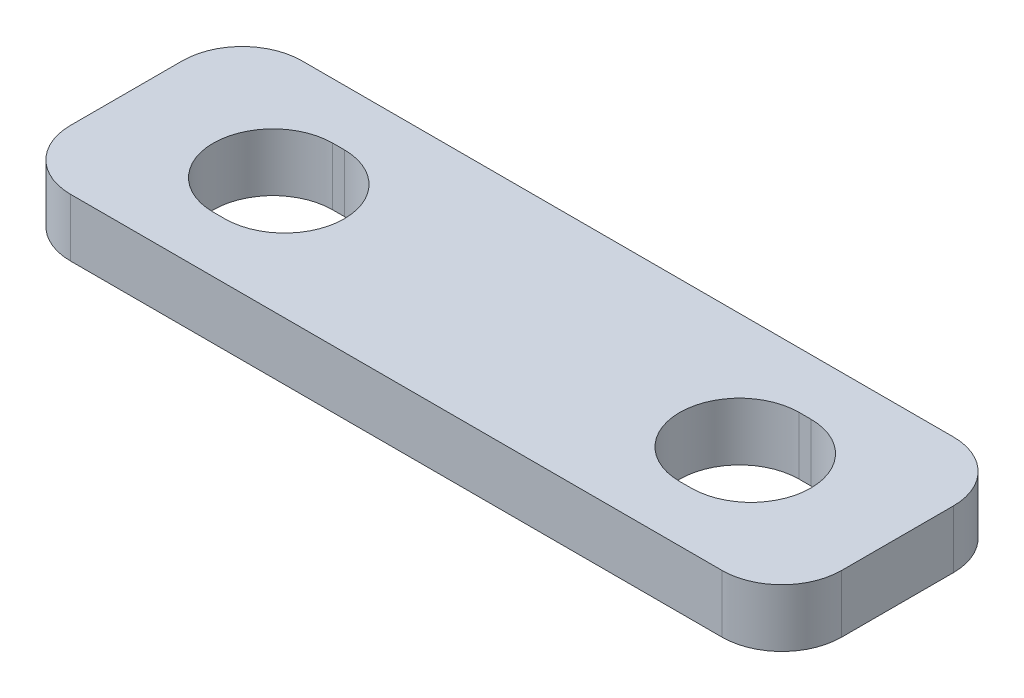
ISO-10303-21;
HEADER;
FILE_DESCRIPTION(('STEP AP214'),'2;1');
FILE_NAME('part.step','',(''),(''),'','','');
FILE_SCHEMA(('AUTOMOTIVE_DESIGN { 1 0 10303 214 1 1 1 1 }'));
ENDSEC;
DATA;
#1=APPLICATION_CONTEXT('core data for automotive mechanical design processes');
#2=APPLICATION_PROTOCOL_DEFINITION('international standard','automotive_design',2000,#1);
#3=PRODUCT_CONTEXT('',#1,'mechanical');
#4=PRODUCT('Part','Part','',(#3));
#5=PRODUCT_RELATED_PRODUCT_CATEGORY('part','',(#4));
#6=PRODUCT_DEFINITION_FORMATION('','',#4);
#7=PRODUCT_DEFINITION_CONTEXT('part definition',#1,'design');
#8=PRODUCT_DEFINITION('design','',#6,#7);
#9=PRODUCT_DEFINITION_SHAPE('','',#8);
#10=(LENGTH_UNIT() NAMED_UNIT(*) SI_UNIT(.MILLI.,.METRE.));
#11=(NAMED_UNIT(*) PLANE_ANGLE_UNIT() SI_UNIT($,.RADIAN.));
#12=(NAMED_UNIT(*) SI_UNIT($,.STERADIAN.) SOLID_ANGLE_UNIT());
#13=UNCERTAINTY_MEASURE_WITH_UNIT(LENGTH_MEASURE(1.E-05),#10,'distance_accuracy_value','');
#14=(GEOMETRIC_REPRESENTATION_CONTEXT(3) GLOBAL_UNCERTAINTY_ASSIGNED_CONTEXT((#13)) GLOBAL_UNIT_ASSIGNED_CONTEXT((#10,
#11,#12)) REPRESENTATION_CONTEXT('',''));
#15=CARTESIAN_POINT('',(0.,0.,0.));
#16=DIRECTION('',(0.,0.,1.));
#17=DIRECTION('',(1.,0.,0.));
#18=AXIS2_PLACEMENT_3D('',#15,#16,#17);
#19=CARTESIAN_POINT('',(0.,1.5,0.));
#20=DIRECTION('',(0.,1.,0.));
#21=DIRECTION('',(0.,0.,1.));
#22=AXIS2_PLACEMENT_3D('',#19,#20,#21);
#23=PLANE('',#22);
#24=DIRECTION('',(0.,0.,1.));
#25=VECTOR('',#24,1.);
#26=CARTESIAN_POINT('',(0.,1.5,-6.));
#27=LINE('',#26,#25);
#28=CARTESIAN_POINT('',(0.,1.5,-4.45));
#29=VERTEX_POINT('',#28);
#30=CARTESIAN_POINT('',(0.,1.5,-1.55));
#31=VERTEX_POINT('',#30);
#32=EDGE_CURVE('E252',#29,#31,#27,.T.);
#33=ORIENTED_EDGE('',*,*,#32,.T.);
#34=CARTESIAN_POINT('',(1.55,1.5,-1.55));
#35=DIRECTION('',(0.,1.,0.));
#36=DIRECTION('',(0.,0.,1.));
#37=AXIS2_PLACEMENT_3D('',#34,#35,#36);
#38=CIRCLE('',#37,1.55);
#39=CARTESIAN_POINT('',(1.55,1.5,0.));
#40=VERTEX_POINT('',#39);
#41=EDGE_CURVE('E314',#31,#40,#38,.T.);
#42=ORIENTED_EDGE('',*,*,#41,.T.);
#43=DIRECTION('',(1.,0.,0.));
#44=VECTOR('',#43,1.);
#45=CARTESIAN_POINT('',(0.,1.5,0.));
#46=LINE('',#45,#44);
#47=CARTESIAN_POINT('',(18.45,1.5,0.));
#48=VERTEX_POINT('',#47);
#49=EDGE_CURVE('E256',#40,#48,#46,.T.);
#50=ORIENTED_EDGE('',*,*,#49,.T.);
#51=CARTESIAN_POINT('',(18.45,1.5,-1.55));
#52=DIRECTION('',(0.,1.,0.));
#53=DIRECTION('',(0.,0.,1.));
#54=AXIS2_PLACEMENT_3D('',#51,#52,#53);
#55=CIRCLE('',#54,1.55);
#56=CARTESIAN_POINT('',(20.,1.5,-1.55));
#57=VERTEX_POINT('',#56);
#58=EDGE_CURVE('E308',#48,#57,#55,.T.);
#59=ORIENTED_EDGE('',*,*,#58,.T.);
#60=DIRECTION('',(0.,0.,-1.));
#61=VECTOR('',#60,1.);
#62=CARTESIAN_POINT('',(20.,1.5,-6.));
#63=LINE('',#62,#61);
#64=CARTESIAN_POINT('',(20.,1.5,-4.45));
#65=VERTEX_POINT('',#64);
#66=EDGE_CURVE('E261',#57,#65,#63,.T.);
#67=ORIENTED_EDGE('',*,*,#66,.T.);
#68=CARTESIAN_POINT('',(18.45,1.5,-4.45));
#69=DIRECTION('',(0.,1.,0.));
#70=DIRECTION('',(0.,0.,1.));
#71=AXIS2_PLACEMENT_3D('',#68,#69,#70);
#72=CIRCLE('',#71,1.55);
#73=CARTESIAN_POINT('',(18.45,1.5,-6.));
#74=VERTEX_POINT('',#73);
#75=EDGE_CURVE('E62',#65,#74,#72,.T.);
#76=ORIENTED_EDGE('',*,*,#75,.T.);
#77=DIRECTION('',(-1.,0.,0.));
#78=VECTOR('',#77,1.);
#79=CARTESIAN_POINT('',(20.,1.5,-6.));
#80=LINE('',#79,#78);
#81=CARTESIAN_POINT('',(1.55,1.5,-6.));
#82=VERTEX_POINT('',#81);
#83=EDGE_CURVE('E264',#74,#82,#80,.T.);
#84=ORIENTED_EDGE('',*,*,#83,.T.);
#85=CARTESIAN_POINT('',(1.55,1.5,-4.45));
#86=DIRECTION('',(0.,1.,0.));
#87=DIRECTION('',(0.,0.,1.));
#88=AXIS2_PLACEMENT_3D('',#85,#86,#87);
#89=CIRCLE('',#88,1.55);
#90=EDGE_CURVE('E311',#82,#29,#89,.T.);
#91=ORIENTED_EDGE('',*,*,#90,.T.);
#92=EDGE_LOOP('',(#33,#42,#50,#59,#67,#76,#84,#91));
#93=FACE_BOUND('',#92,.T.);
#94=DIRECTION('',(-1.,0.,0.));
#95=VECTOR('',#94,1.);
#96=CARTESIAN_POINT('',(16.2,1.5,-4.55));
#97=LINE('',#96,#95);
#98=CARTESIAN_POINT('',(16.2,1.5,-4.55));
#99=VERTEX_POINT('',#98);
#100=CARTESIAN_POINT('',(15.9,1.5,-4.55));
#101=VERTEX_POINT('',#100);
#102=EDGE_CURVE('E212',#99,#101,#97,.T.);
#103=ORIENTED_EDGE('',*,*,#102,.F.);
#104=CARTESIAN_POINT('',(16.2,1.5,-3.));
#105=DIRECTION('',(0.,1.,0.));
#106=DIRECTION('',(0.,0.,1.));
#107=AXIS2_PLACEMENT_3D('',#104,#105,#106);
#108=CIRCLE('',#107,1.55);
#109=CARTESIAN_POINT('',(16.2,1.5,-1.45));
#110=VERTEX_POINT('',#109);
#111=EDGE_CURVE('E209',#110,#99,#108,.T.);
#112=ORIENTED_EDGE('',*,*,#111,.F.);
#113=DIRECTION('',(1.,0.,0.));
#114=VECTOR('',#113,1.);
#115=CARTESIAN_POINT('',(16.2,1.5,-1.45));
#116=LINE('',#115,#114);
#117=CARTESIAN_POINT('',(15.9,1.5,-1.45));
#118=VERTEX_POINT('',#117);
#119=EDGE_CURVE('E220',#118,#110,#116,.T.);
#120=ORIENTED_EDGE('',*,*,#119,.F.);
#121=CARTESIAN_POINT('',(15.9,1.5,-3.));
#122=DIRECTION('',(0.,1.,0.));
#123=DIRECTION('',(0.,0.,1.));
#124=AXIS2_PLACEMENT_3D('',#121,#122,#123);
#125=CIRCLE('',#124,1.55);
#126=EDGE_CURVE('E216',#101,#118,#125,.T.);
#127=ORIENTED_EDGE('',*,*,#126,.F.);
#128=EDGE_LOOP('',(#103,#112,#120,#127));
#129=FACE_BOUND('',#128,.T.);
#130=DIRECTION('',(1.,0.,0.));
#131=VECTOR('',#130,1.);
#132=CARTESIAN_POINT('',(3.8,1.5,-1.45));
#133=LINE('',#132,#131);
#134=CARTESIAN_POINT('',(3.8,1.5,-1.45));
#135=VERTEX_POINT('',#134);
#136=CARTESIAN_POINT('',(4.1,1.5,-1.45));
#137=VERTEX_POINT('',#136);
#138=EDGE_CURVE('E167',#135,#137,#133,.T.);
#139=ORIENTED_EDGE('',*,*,#138,.F.);
#140=CARTESIAN_POINT('',(3.8,1.5,-3.));
#141=DIRECTION('',(0.,1.,0.));
#142=DIRECTION('',(0.,0.,-1.));
#143=AXIS2_PLACEMENT_3D('',#140,#141,#142);
#144=CIRCLE('',#143,1.55);
#145=CARTESIAN_POINT('',(3.8,1.5,-4.55));
#146=VERTEX_POINT('',#145);
#147=EDGE_CURVE('E156',#146,#135,#144,.T.);
#148=ORIENTED_EDGE('',*,*,#147,.F.);
#149=DIRECTION('',(-1.,0.,0.));
#150=VECTOR('',#149,1.);
#151=CARTESIAN_POINT('',(3.8,1.5,-4.55));
#152=LINE('',#151,#150);
#153=CARTESIAN_POINT('',(4.1,1.5,-4.55));
#154=VERTEX_POINT('',#153);
#155=EDGE_CURVE('E185',#154,#146,#152,.T.);
#156=ORIENTED_EDGE('',*,*,#155,.F.);
#157=CARTESIAN_POINT('',(4.1,1.5,-3.));
#158=DIRECTION('',(0.,1.,0.));
#159=DIRECTION('',(0.,0.,-1.));
#160=AXIS2_PLACEMENT_3D('',#157,#158,#159);
#161=CIRCLE('',#160,1.55);
#162=EDGE_CURVE('E181',#137,#154,#161,.T.);
#163=ORIENTED_EDGE('',*,*,#162,.F.);
#164=EDGE_LOOP('',(#139,#148,#156,#163));
#165=FACE_BOUND('',#164,.T.);
#166=ADVANCED_FACE('F39',(#93,#129,#165),#23,.T.);
#167=CARTESIAN_POINT('',(0.,0.,0.));
#168=DIRECTION('',(0.,1.,0.));
#169=DIRECTION('',(0.,0.,1.));
#170=AXIS2_PLACEMENT_3D('',#167,#168,#169);
#171=PLANE('',#170);
#172=CARTESIAN_POINT('',(16.2,0.,-3.));
#173=DIRECTION('',(0.,1.,0.));
#174=DIRECTION('',(0.,0.,1.));
#175=AXIS2_PLACEMENT_3D('',#172,#173,#174);
#176=CIRCLE('',#175,1.55);
#177=CARTESIAN_POINT('',(16.2,0.,-1.45));
#178=VERTEX_POINT('',#177);
#179=CARTESIAN_POINT('',(16.2,0.,-4.55));
#180=VERTEX_POINT('',#179);
#181=EDGE_CURVE('E176',#178,#180,#176,.T.);
#182=ORIENTED_EDGE('',*,*,#181,.T.);
#183=DIRECTION('',(-1.,0.,0.));
#184=VECTOR('',#183,1.);
#185=CARTESIAN_POINT('',(16.2,0.,-4.55));
#186=LINE('',#185,#184);
#187=CARTESIAN_POINT('',(15.9,0.,-4.55));
#188=VERTEX_POINT('',#187);
#189=EDGE_CURVE('E227',#180,#188,#186,.T.);
#190=ORIENTED_EDGE('',*,*,#189,.T.);
#191=CARTESIAN_POINT('',(15.9,0.,-3.));
#192=DIRECTION('',(0.,1.,0.));
#193=DIRECTION('',(0.,0.,1.));
#194=AXIS2_PLACEMENT_3D('',#191,#192,#193);
#195=CIRCLE('',#194,1.55);
#196=CARTESIAN_POINT('',(15.9,0.,-1.45));
#197=VERTEX_POINT('',#196);
#198=EDGE_CURVE('E231',#188,#197,#195,.T.);
#199=ORIENTED_EDGE('',*,*,#198,.T.);
#200=DIRECTION('',(1.,0.,0.));
#201=VECTOR('',#200,1.);
#202=CARTESIAN_POINT('',(16.2,0.,-1.45));
#203=LINE('',#202,#201);
#204=EDGE_CURVE('E213',#197,#178,#203,.T.);
#205=ORIENTED_EDGE('',*,*,#204,.T.);
#206=EDGE_LOOP('',(#182,#190,#199,#205));
#207=FACE_BOUND('',#206,.T.);
#208=DIRECTION('',(1.,0.,0.));
#209=VECTOR('',#208,1.);
#210=CARTESIAN_POINT('',(0.,0.,0.));
#211=LINE('',#210,#209);
#212=CARTESIAN_POINT('',(1.55,0.,0.));
#213=VERTEX_POINT('',#212);
#214=CARTESIAN_POINT('',(18.45,0.,0.));
#215=VERTEX_POINT('',#214);
#216=EDGE_CURVE('E271',#213,#215,#211,.T.);
#217=ORIENTED_EDGE('',*,*,#216,.F.);
#218=CARTESIAN_POINT('',(1.55,0.,-1.55));
#219=DIRECTION('',(0.,1.,0.));
#220=DIRECTION('',(0.,0.,1.));
#221=AXIS2_PLACEMENT_3D('',#218,#219,#220);
#222=CIRCLE('',#221,1.55);
#223=CARTESIAN_POINT('',(0.,0.,-1.55));
#224=VERTEX_POINT('',#223);
#225=EDGE_CURVE('E296',#213,#224,#222,.F.);
#226=ORIENTED_EDGE('',*,*,#225,.T.);
#227=DIRECTION('',(0.,0.,1.));
#228=VECTOR('',#227,1.);
#229=CARTESIAN_POINT('',(0.,0.,-6.));
#230=LINE('',#229,#228);
#231=CARTESIAN_POINT('',(0.,0.,-4.45));
#232=VERTEX_POINT('',#231);
#233=EDGE_CURVE('E251',#232,#224,#230,.T.);
#234=ORIENTED_EDGE('',*,*,#233,.F.);
#235=CARTESIAN_POINT('',(1.55,0.,-4.45));
#236=DIRECTION('',(0.,1.,0.));
#237=DIRECTION('',(0.,0.,1.));
#238=AXIS2_PLACEMENT_3D('',#235,#236,#237);
#239=CIRCLE('',#238,1.55);
#240=CARTESIAN_POINT('',(1.55,0.,-6.));
#241=VERTEX_POINT('',#240);
#242=EDGE_CURVE('E293',#232,#241,#239,.F.);
#243=ORIENTED_EDGE('',*,*,#242,.T.);
#244=DIRECTION('',(-1.,0.,0.));
#245=VECTOR('',#244,1.);
#246=CARTESIAN_POINT('',(20.,0.,-6.));
#247=LINE('',#246,#245);
#248=CARTESIAN_POINT('',(18.45,0.,-6.));
#249=VERTEX_POINT('',#248);
#250=EDGE_CURVE('E257',#249,#241,#247,.T.);
#251=ORIENTED_EDGE('',*,*,#250,.F.);
#252=CARTESIAN_POINT('',(18.45,0.,-4.45));
#253=DIRECTION('',(0.,1.,0.));
#254=DIRECTION('',(0.,0.,1.));
#255=AXIS2_PLACEMENT_3D('',#252,#253,#254);
#256=CIRCLE('',#255,1.55);
#257=CARTESIAN_POINT('',(20.,0.,-4.45));
#258=VERTEX_POINT('',#257);
#259=EDGE_CURVE('E287',#249,#258,#256,.F.);
#260=ORIENTED_EDGE('',*,*,#259,.T.);
#261=DIRECTION('',(0.,0.,-1.));
#262=VECTOR('',#261,1.);
#263=CARTESIAN_POINT('',(20.,0.,-6.));
#264=LINE('',#263,#262);
#265=CARTESIAN_POINT('',(20.,0.,-1.55));
#266=VERTEX_POINT('',#265);
#267=EDGE_CURVE('E275',#266,#258,#264,.T.);
#268=ORIENTED_EDGE('',*,*,#267,.F.);
#269=CARTESIAN_POINT('',(18.45,0.,-1.55));
#270=DIRECTION('',(0.,1.,0.));
#271=DIRECTION('',(0.,0.,1.));
#272=AXIS2_PLACEMENT_3D('',#269,#270,#271);
#273=CIRCLE('',#272,1.55);
#274=EDGE_CURVE('E290',#266,#215,#273,.F.);
#275=ORIENTED_EDGE('',*,*,#274,.T.);
#276=EDGE_LOOP('',(#217,#226,#234,#243,#251,#260,#268,#275));
#277=FACE_BOUND('',#276,.T.);
#278=CARTESIAN_POINT('',(3.8,0.,-3.));
#279=DIRECTION('',(0.,1.,0.));
#280=DIRECTION('',(0.,0.,-1.));
#281=AXIS2_PLACEMENT_3D('',#278,#279,#280);
#282=CIRCLE('',#281,1.55);
#283=CARTESIAN_POINT('',(3.8,0.,-4.55));
#284=VERTEX_POINT('',#283);
#285=CARTESIAN_POINT('',(3.8,0.,-1.45));
#286=VERTEX_POINT('',#285);
#287=EDGE_CURVE('E190',#284,#286,#282,.T.);
#288=ORIENTED_EDGE('',*,*,#287,.T.);
#289=DIRECTION('',(1.,0.,0.));
#290=VECTOR('',#289,1.);
#291=CARTESIAN_POINT('',(3.8,0.,-1.45));
#292=LINE('',#291,#290);
#293=CARTESIAN_POINT('',(4.1,0.,-1.45));
#294=VERTEX_POINT('',#293);
#295=EDGE_CURVE('E174',#286,#294,#292,.T.);
#296=ORIENTED_EDGE('',*,*,#295,.T.);
#297=CARTESIAN_POINT('',(4.1,0.,-3.));
#298=DIRECTION('',(0.,1.,0.));
#299=DIRECTION('',(0.,0.,-1.));
#300=AXIS2_PLACEMENT_3D('',#297,#298,#299);
#301=CIRCLE('',#300,1.55);
#302=CARTESIAN_POINT('',(4.1,0.,-4.55));
#303=VERTEX_POINT('',#302);
#304=EDGE_CURVE('E195',#294,#303,#301,.T.);
#305=ORIENTED_EDGE('',*,*,#304,.T.);
#306=DIRECTION('',(-1.,0.,0.));
#307=VECTOR('',#306,1.);
#308=CARTESIAN_POINT('',(3.8,0.,-4.55));
#309=LINE('',#308,#307);
#310=EDGE_CURVE('E168',#303,#284,#309,.T.);
#311=ORIENTED_EDGE('',*,*,#310,.T.);
#312=EDGE_LOOP('',(#288,#296,#305,#311));
#313=FACE_BOUND('',#312,.T.);
#314=ADVANCED_FACE('F337',(#207,#277,#313),#171,.F.);
#315=CARTESIAN_POINT('',(0.,1.5,-6.));
#316=DIRECTION('',(1.,0.,0.));
#317=DIRECTION('',(0.,0.,-1.));
#318=AXIS2_PLACEMENT_3D('',#315,#316,#317);
#319=PLANE('',#318);
#320=ORIENTED_EDGE('',*,*,#233,.T.);
#321=DIRECTION('',(0.,-1.,0.));
#322=VECTOR('',#321,1.);
#323=CARTESIAN_POINT('',(0.,1.5,-1.55));
#324=LINE('',#323,#322);
#325=EDGE_CURVE('E303',#224,#31,#324,.F.);
#326=ORIENTED_EDGE('',*,*,#325,.T.);
#327=ORIENTED_EDGE('',*,*,#32,.F.);
#328=DIRECTION('',(0.,-1.,0.));
#329=VECTOR('',#328,1.);
#330=CARTESIAN_POINT('',(0.,1.5,-4.45));
#331=LINE('',#330,#329);
#332=EDGE_CURVE('E299',#29,#232,#331,.T.);
#333=ORIENTED_EDGE('',*,*,#332,.T.);
#334=EDGE_LOOP('',(#320,#326,#327,#333));
#335=FACE_BOUND('',#334,.T.);
#336=ADVANCED_FACE('F346',(#335),#319,.F.);
#337=CARTESIAN_POINT('',(0.,1.5,0.));
#338=DIRECTION('',(0.,0.,-1.));
#339=DIRECTION('',(-1.,0.,0.));
#340=AXIS2_PLACEMENT_3D('',#337,#338,#339);
#341=PLANE('',#340);
#342=ORIENTED_EDGE('',*,*,#49,.F.);
#343=DIRECTION('',(0.,-1.,0.));
#344=VECTOR('',#343,1.);
#345=CARTESIAN_POINT('',(1.55,1.5,0.));
#346=LINE('',#345,#344);
#347=EDGE_CURVE('E283',#40,#213,#346,.T.);
#348=ORIENTED_EDGE('',*,*,#347,.T.);
#349=ORIENTED_EDGE('',*,*,#216,.T.);
#350=DIRECTION('',(0.,-1.,0.));
#351=VECTOR('',#350,1.);
#352=CARTESIAN_POINT('',(18.45,1.5,0.));
#353=LINE('',#352,#351);
#354=EDGE_CURVE('E267',#215,#48,#353,.F.);
#355=ORIENTED_EDGE('',*,*,#354,.T.);
#356=EDGE_LOOP('',(#342,#348,#349,#355));
#357=FACE_BOUND('',#356,.T.);
#358=ADVANCED_FACE('F354',(#357),#341,.F.);
#359=CARTESIAN_POINT('',(20.,1.5,-6.));
#360=DIRECTION('',(-1.,0.,0.));
#361=DIRECTION('',(0.,0.,1.));
#362=AXIS2_PLACEMENT_3D('',#359,#360,#361);
#363=PLANE('',#362);
#364=ORIENTED_EDGE('',*,*,#66,.F.);
#365=DIRECTION('',(0.,-1.,0.));
#366=VECTOR('',#365,1.);
#367=CARTESIAN_POINT('',(20.,1.5,-1.55));
#368=LINE('',#367,#366);
#369=EDGE_CURVE('E11',#57,#266,#368,.T.);
#370=ORIENTED_EDGE('',*,*,#369,.T.);
#371=ORIENTED_EDGE('',*,*,#267,.T.);
#372=DIRECTION('',(0.,-1.,0.));
#373=VECTOR('',#372,1.);
#374=CARTESIAN_POINT('',(20.,1.5,-4.45));
#375=LINE('',#374,#373);
#376=EDGE_CURVE('E48',#258,#65,#375,.F.);
#377=ORIENTED_EDGE('',*,*,#376,.T.);
#378=EDGE_LOOP('',(#364,#370,#371,#377));
#379=FACE_BOUND('',#378,.T.);
#380=ADVANCED_FACE('F326',(#379),#363,.F.);
#381=CARTESIAN_POINT('',(20.,1.5,-6.));
#382=DIRECTION('',(0.,0.,1.));
#383=DIRECTION('',(1.,0.,0.));
#384=AXIS2_PLACEMENT_3D('',#381,#382,#383);
#385=PLANE('',#384);
#386=ORIENTED_EDGE('',*,*,#250,.T.);
#387=DIRECTION('',(0.,-1.,0.));
#388=VECTOR('',#387,1.);
#389=CARTESIAN_POINT('',(1.55,1.5,-6.));
#390=LINE('',#389,#388);
#391=EDGE_CURVE('E55',#241,#82,#390,.F.);
#392=ORIENTED_EDGE('',*,*,#391,.T.);
#393=ORIENTED_EDGE('',*,*,#83,.F.);
#394=DIRECTION('',(0.,-1.,0.));
#395=VECTOR('',#394,1.);
#396=CARTESIAN_POINT('',(18.45,1.5,-6.));
#397=LINE('',#396,#395);
#398=EDGE_CURVE('E317',#74,#249,#397,.T.);
#399=ORIENTED_EDGE('',*,*,#398,.T.);
#400=EDGE_LOOP('',(#386,#392,#393,#399));
#401=FACE_BOUND('',#400,.T.);
#402=ADVANCED_FACE('F334',(#401),#385,.F.);
#403=CARTESIAN_POINT('',(16.2,1.5,-3.));
#404=DIRECTION('',(0.,-1.,0.));
#405=DIRECTION('',(0.,0.,-1.));
#406=AXIS2_PLACEMENT_3D('',#403,#404,#405);
#407=CYLINDRICAL_SURFACE('',#406,1.55);
#408=ORIENTED_EDGE('',*,*,#181,.F.);
#409=DIRECTION('',(0.,-1.,0.));
#410=VECTOR('',#409,1.);
#411=CARTESIAN_POINT('',(16.2,1.5,-1.45));
#412=LINE('',#411,#410);
#413=EDGE_CURVE('E223',#110,#178,#412,.T.);
#414=ORIENTED_EDGE('',*,*,#413,.F.);
#415=ORIENTED_EDGE('',*,*,#111,.T.);
#416=DIRECTION('',(0.,-1.,0.));
#417=VECTOR('',#416,1.);
#418=CARTESIAN_POINT('',(16.2,1.5,-4.55));
#419=LINE('',#418,#417);
#420=EDGE_CURVE('E247',#99,#180,#419,.T.);
#421=ORIENTED_EDGE('',*,*,#420,.T.);
#422=EDGE_LOOP('',(#408,#414,#415,#421));
#423=FACE_BOUND('',#422,.T.);
#424=ADVANCED_FACE('F372',(#423),#407,.F.);
#425=CARTESIAN_POINT('',(16.2,1.5,-4.55));
#426=DIRECTION('',(0.,0.,1.));
#427=DIRECTION('',(1.,0.,0.));
#428=AXIS2_PLACEMENT_3D('',#425,#426,#427);
#429=PLANE('',#428);
#430=ORIENTED_EDGE('',*,*,#189,.F.);
#431=ORIENTED_EDGE('',*,*,#420,.F.);
#432=ORIENTED_EDGE('',*,*,#102,.T.);
#433=DIRECTION('',(0.,-1.,0.));
#434=VECTOR('',#433,1.);
#435=CARTESIAN_POINT('',(15.9,1.5,-4.55));
#436=LINE('',#435,#434);
#437=EDGE_CURVE('E244',#101,#188,#436,.T.);
#438=ORIENTED_EDGE('',*,*,#437,.T.);
#439=EDGE_LOOP('',(#430,#431,#432,#438));
#440=FACE_BOUND('',#439,.T.);
#441=ADVANCED_FACE('F408',(#440),#429,.T.);
#442=CARTESIAN_POINT('',(15.9,1.5,-3.));
#443=DIRECTION('',(0.,-1.,0.));
#444=DIRECTION('',(0.,0.,-1.));
#445=AXIS2_PLACEMENT_3D('',#442,#443,#444);
#446=CYLINDRICAL_SURFACE('',#445,1.55);
#447=ORIENTED_EDGE('',*,*,#198,.F.);
#448=ORIENTED_EDGE('',*,*,#437,.F.);
#449=ORIENTED_EDGE('',*,*,#126,.T.);
#450=DIRECTION('',(0.,-1.,0.));
#451=VECTOR('',#450,1.);
#452=CARTESIAN_POINT('',(15.9,1.5,-1.45));
#453=LINE('',#452,#451);
#454=EDGE_CURVE('E241',#118,#197,#453,.T.);
#455=ORIENTED_EDGE('',*,*,#454,.T.);
#456=EDGE_LOOP('',(#447,#448,#449,#455));
#457=FACE_BOUND('',#456,.T.);
#458=ADVANCED_FACE('F405',(#457),#446,.F.);
#459=CARTESIAN_POINT('',(16.2,1.5,-1.45));
#460=DIRECTION('',(0.,0.,-1.));
#461=DIRECTION('',(-1.,0.,0.));
#462=AXIS2_PLACEMENT_3D('',#459,#460,#461);
#463=PLANE('',#462);
#464=ORIENTED_EDGE('',*,*,#204,.F.);
#465=ORIENTED_EDGE('',*,*,#454,.F.);
#466=ORIENTED_EDGE('',*,*,#119,.T.);
#467=ORIENTED_EDGE('',*,*,#413,.T.);
#468=EDGE_LOOP('',(#464,#465,#466,#467));
#469=FACE_BOUND('',#468,.T.);
#470=ADVANCED_FACE('F402',(#469),#463,.T.);
#471=CARTESIAN_POINT('',(3.8,1.5,-3.));
#472=DIRECTION('',(0.,-1.,0.));
#473=DIRECTION('',(0.,0.,-1.));
#474=AXIS2_PLACEMENT_3D('',#471,#472,#473);
#475=CYLINDRICAL_SURFACE('',#474,1.55);
#476=ORIENTED_EDGE('',*,*,#287,.F.);
#477=DIRECTION('',(0.,-1.,0.));
#478=VECTOR('',#477,1.);
#479=CARTESIAN_POINT('',(3.8,1.5,-4.55));
#480=LINE('',#479,#478);
#481=EDGE_CURVE('E162',#146,#284,#480,.T.);
#482=ORIENTED_EDGE('',*,*,#481,.F.);
#483=ORIENTED_EDGE('',*,*,#147,.T.);
#484=DIRECTION('',(0.,-1.,0.));
#485=VECTOR('',#484,1.);
#486=CARTESIAN_POINT('',(3.8,1.5,-1.45));
#487=LINE('',#486,#485);
#488=EDGE_CURVE('E159',#135,#286,#487,.T.);
#489=ORIENTED_EDGE('',*,*,#488,.T.);
#490=EDGE_LOOP('',(#476,#482,#483,#489));
#491=FACE_BOUND('',#490,.T.);
#492=ADVANCED_FACE('F158',(#491),#475,.F.);
#493=CARTESIAN_POINT('',(3.8,1.5,-1.45));
#494=DIRECTION('',(0.,0.,-1.));
#495=DIRECTION('',(-1.,0.,0.));
#496=AXIS2_PLACEMENT_3D('',#493,#494,#495);
#497=PLANE('',#496);
#498=ORIENTED_EDGE('',*,*,#295,.F.);
#499=ORIENTED_EDGE('',*,*,#488,.F.);
#500=ORIENTED_EDGE('',*,*,#138,.T.);
#501=DIRECTION('',(0.,-1.,0.));
#502=VECTOR('',#501,1.);
#503=CARTESIAN_POINT('',(4.1,1.5,-1.45));
#504=LINE('',#503,#502);
#505=EDGE_CURVE('E177',#137,#294,#504,.T.);
#506=ORIENTED_EDGE('',*,*,#505,.T.);
#507=EDGE_LOOP('',(#498,#499,#500,#506));
#508=FACE_BOUND('',#507,.T.);
#509=ADVANCED_FACE('F171',(#508),#497,.T.);
#510=CARTESIAN_POINT('',(4.1,1.5,-3.));
#511=DIRECTION('',(0.,-1.,0.));
#512=DIRECTION('',(0.,0.,-1.));
#513=AXIS2_PLACEMENT_3D('',#510,#511,#512);
#514=CYLINDRICAL_SURFACE('',#513,1.55);
#515=ORIENTED_EDGE('',*,*,#304,.F.);
#516=ORIENTED_EDGE('',*,*,#505,.F.);
#517=ORIENTED_EDGE('',*,*,#162,.T.);
#518=DIRECTION('',(0.,-1.,0.));
#519=VECTOR('',#518,1.);
#520=CARTESIAN_POINT('',(4.1,1.5,-4.55));
#521=LINE('',#520,#519);
#522=EDGE_CURVE('E204',#154,#303,#521,.T.);
#523=ORIENTED_EDGE('',*,*,#522,.T.);
#524=EDGE_LOOP('',(#515,#516,#517,#523));
#525=FACE_BOUND('',#524,.T.);
#526=ADVANCED_FACE('F388',(#525),#514,.F.);
#527=CARTESIAN_POINT('',(3.8,1.5,-4.55));
#528=DIRECTION('',(0.,0.,1.));
#529=DIRECTION('',(1.,0.,0.));
#530=AXIS2_PLACEMENT_3D('',#527,#528,#529);
#531=PLANE('',#530);
#532=ORIENTED_EDGE('',*,*,#310,.F.);
#533=ORIENTED_EDGE('',*,*,#522,.F.);
#534=ORIENTED_EDGE('',*,*,#155,.T.);
#535=ORIENTED_EDGE('',*,*,#481,.T.);
#536=EDGE_LOOP('',(#532,#533,#534,#535));
#537=FACE_BOUND('',#536,.T.);
#538=ADVANCED_FACE('F384',(#537),#531,.T.);
#539=CARTESIAN_POINT('',(1.55,1.5,-1.55));
#540=DIRECTION('',(0.,-1.,0.));
#541=DIRECTION('',(0.,0.,-1.));
#542=AXIS2_PLACEMENT_3D('',#539,#540,#541);
#543=CYLINDRICAL_SURFACE('',#542,1.55);
#544=ORIENTED_EDGE('',*,*,#41,.F.);
#545=ORIENTED_EDGE('',*,*,#325,.F.);
#546=ORIENTED_EDGE('',*,*,#225,.F.);
#547=ORIENTED_EDGE('',*,*,#347,.F.);
#548=EDGE_LOOP('',(#544,#545,#546,#547));
#549=FACE_BOUND('',#548,.T.);
#550=ADVANCED_FACE('F352',(#549),#543,.T.);
#551=CARTESIAN_POINT('',(1.55,1.5,-4.45));
#552=DIRECTION('',(0.,-1.,0.));
#553=DIRECTION('',(0.,0.,-1.));
#554=AXIS2_PLACEMENT_3D('',#551,#552,#553);
#555=CYLINDRICAL_SURFACE('',#554,1.55);
#556=ORIENTED_EDGE('',*,*,#90,.F.);
#557=ORIENTED_EDGE('',*,*,#391,.F.);
#558=ORIENTED_EDGE('',*,*,#242,.F.);
#559=ORIENTED_EDGE('',*,*,#332,.F.);
#560=EDGE_LOOP('',(#556,#557,#558,#559));
#561=FACE_BOUND('',#560,.T.);
#562=ADVANCED_FACE('F343',(#561),#555,.T.);
#563=CARTESIAN_POINT('',(18.45,1.5,-1.55));
#564=DIRECTION('',(0.,-1.,0.));
#565=DIRECTION('',(0.,0.,-1.));
#566=AXIS2_PLACEMENT_3D('',#563,#564,#565);
#567=CYLINDRICAL_SURFACE('',#566,1.55);
#568=ORIENTED_EDGE('',*,*,#58,.F.);
#569=ORIENTED_EDGE('',*,*,#354,.F.);
#570=ORIENTED_EDGE('',*,*,#274,.F.);
#571=ORIENTED_EDGE('',*,*,#369,.F.);
#572=EDGE_LOOP('',(#568,#569,#570,#571));
#573=FACE_BOUND('',#572,.T.);
#574=ADVANCED_FACE('F357',(#573),#567,.T.);
#575=CARTESIAN_POINT('',(18.45,1.5,-4.45));
#576=DIRECTION('',(0.,-1.,0.));
#577=DIRECTION('',(0.,0.,-1.));
#578=AXIS2_PLACEMENT_3D('',#575,#576,#577);
#579=CYLINDRICAL_SURFACE('',#578,1.55);
#580=ORIENTED_EDGE('',*,*,#75,.F.);
#581=ORIENTED_EDGE('',*,*,#376,.F.);
#582=ORIENTED_EDGE('',*,*,#259,.F.);
#583=ORIENTED_EDGE('',*,*,#398,.F.);
#584=EDGE_LOOP('',(#580,#581,#582,#583));
#585=FACE_BOUND('',#584,.T.);
#586=ADVANCED_FACE('F41',(#585),#579,.T.);
#587=CLOSED_SHELL('',(#166,#314,#336,#358,#380,#402,#424,#441,#458,#470,#492,#509,#526,#538,
#550,#562,#574,#586));
#588=MANIFOLD_SOLID_BREP('B2',#587);
#589=ADVANCED_BREP_SHAPE_REPRESENTATION('',(#18,#588),#14);
#590=SHAPE_DEFINITION_REPRESENTATION(#9,#589);
ENDSEC;
END-ISO-10303-21;
